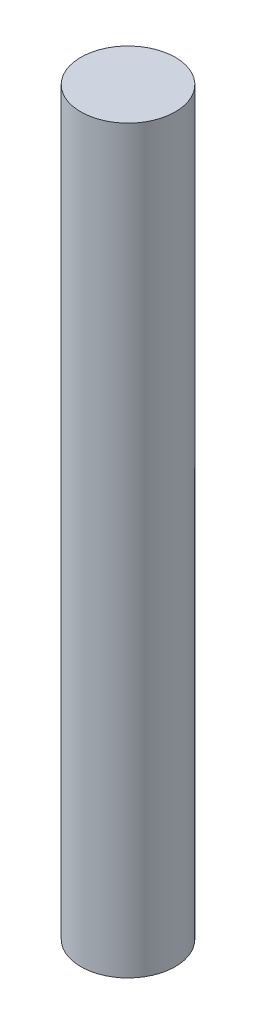
ISO-10303-21;
HEADER;
FILE_DESCRIPTION(('STEP AP214'),'2;1');
FILE_NAME('part.step','',(''),(''),'','','');
FILE_SCHEMA(('AUTOMOTIVE_DESIGN { 1 0 10303 214 1 1 1 1 }'));
ENDSEC;
DATA;
#1=APPLICATION_CONTEXT('core data for automotive mechanical design processes');
#2=APPLICATION_PROTOCOL_DEFINITION('international standard','automotive_design',2000,#1);
#3=PRODUCT_CONTEXT('',#1,'mechanical');
#4=PRODUCT('Part','Part','',(#3));
#5=PRODUCT_RELATED_PRODUCT_CATEGORY('part','',(#4));
#6=PRODUCT_DEFINITION_FORMATION('','',#4);
#7=PRODUCT_DEFINITION_CONTEXT('part definition',#1,'design');
#8=PRODUCT_DEFINITION('design','',#6,#7);
#9=PRODUCT_DEFINITION_SHAPE('','',#8);
#10=(LENGTH_UNIT() NAMED_UNIT(*) SI_UNIT(.MILLI.,.METRE.));
#11=(NAMED_UNIT(*) PLANE_ANGLE_UNIT() SI_UNIT($,.RADIAN.));
#12=(NAMED_UNIT(*) SI_UNIT($,.STERADIAN.) SOLID_ANGLE_UNIT());
#13=UNCERTAINTY_MEASURE_WITH_UNIT(LENGTH_MEASURE(1.E-05),#10,'distance_accuracy_value','');
#14=(GEOMETRIC_REPRESENTATION_CONTEXT(3) GLOBAL_UNCERTAINTY_ASSIGNED_CONTEXT((#13)) GLOBAL_UNIT_ASSIGNED_CONTEXT((#10,
#11,#12)) REPRESENTATION_CONTEXT('',''));
#15=CARTESIAN_POINT('',(0.,0.,0.));
#16=DIRECTION('',(0.,0.,1.));
#17=DIRECTION('',(1.,0.,0.));
#18=AXIS2_PLACEMENT_3D('',#15,#16,#17);
#19=CARTESIAN_POINT('',(0.,12.53,0.));
#20=DIRECTION('',(0.,-1.,0.));
#21=DIRECTION('',(0.,0.,-1.));
#22=AXIS2_PLACEMENT_3D('',#19,#20,#21);
#23=CYLINDRICAL_SURFACE('',#22,0.8);
#24=CARTESIAN_POINT('',(0.,12.53,0.));
#25=DIRECTION('',(0.,1.,0.));
#26=DIRECTION('',(0.,0.,1.));
#27=AXIS2_PLACEMENT_3D('',#24,#25,#26);
#28=CIRCLE('',#27,0.8);
#29=CARTESIAN_POINT('',(0.,12.53,-0.8));
#30=VERTEX_POINT('',#29);
#31=EDGE_CURVE('E10',#30,#30,#28,.T.);
#32=CARTESIAN_POINT('',(0.,0.,0.));
#33=DIRECTION('',(0.,1.,0.));
#34=DIRECTION('',(0.,0.,1.));
#35=AXIS2_PLACEMENT_3D('',#32,#33,#34);
#36=CIRCLE('',#35,0.8);
#37=CARTESIAN_POINT('',(0.,0.,-0.8));
#38=VERTEX_POINT('',#37);
#39=EDGE_CURVE('E46',#38,#38,#36,.T.);
#40=CARTESIAN_POINT('',(0.,12.53,-0.8));
#41=CARTESIAN_POINT('',(0.,12.3994791666667,-0.8));
#42=CARTESIAN_POINT('',(0.,12.2689583333333,-0.8));
#43=CARTESIAN_POINT('',(0.,12.0079166666667,-0.8));
#44=CARTESIAN_POINT('',(0.,11.8773958333333,-0.8));
#45=CARTESIAN_POINT('',(0.,11.6163541666667,-0.8));
#46=CARTESIAN_POINT('',(0.,11.4858333333333,-0.8));
#47=CARTESIAN_POINT('',(0.,11.2247916666667,-0.8));
#48=CARTESIAN_POINT('',(0.,11.0942708333333,-0.8));
#49=CARTESIAN_POINT('',(0.,10.8332291666667,-0.8));
#50=CARTESIAN_POINT('',(0.,10.7027083333333,-0.8));
#51=CARTESIAN_POINT('',(0.,10.4416666666667,-0.8));
#52=CARTESIAN_POINT('',(0.,10.3111458333333,-0.8));
#53=CARTESIAN_POINT('',(0.,10.0501041666667,-0.8));
#54=CARTESIAN_POINT('',(0.,9.91958333333333,-0.8));
#55=CARTESIAN_POINT('',(0.,9.65854166666667,-0.8));
#56=CARTESIAN_POINT('',(0.,9.52802083333333,-0.8));
#57=CARTESIAN_POINT('',(0.,9.26697916666667,-0.8));
#58=CARTESIAN_POINT('',(0.,9.13645833333333,-0.8));
#59=CARTESIAN_POINT('',(0.,8.87541666666666,-0.8));
#60=CARTESIAN_POINT('',(0.,8.74489583333333,-0.8));
#61=CARTESIAN_POINT('',(0.,8.48385416666667,-0.8));
#62=CARTESIAN_POINT('',(0.,8.35333333333333,-0.8));
#63=CARTESIAN_POINT('',(0.,8.09229166666667,-0.8));
#64=CARTESIAN_POINT('',(0.,7.96177083333333,-0.8));
#65=CARTESIAN_POINT('',(0.,7.70072916666666,-0.8));
#66=CARTESIAN_POINT('',(0.,7.57020833333333,-0.8));
#67=CARTESIAN_POINT('',(0.,7.30916666666667,-0.8));
#68=CARTESIAN_POINT('',(0.,7.17864583333333,-0.8));
#69=CARTESIAN_POINT('',(0.,6.91760416666667,-0.8));
#70=CARTESIAN_POINT('',(0.,6.78708333333333,-0.8));
#71=CARTESIAN_POINT('',(0.,6.52604166666667,-0.8));
#72=CARTESIAN_POINT('',(0.,6.39552083333333,-0.8));
#73=CARTESIAN_POINT('',(0.,6.13447916666667,-0.8));
#74=CARTESIAN_POINT('',(0.,6.00395833333333,-0.8));
#75=CARTESIAN_POINT('',(0.,5.74291666666667,-0.8));
#76=CARTESIAN_POINT('',(0.,5.61239583333333,-0.8));
#77=CARTESIAN_POINT('',(0.,5.35135416666667,-0.8));
#78=CARTESIAN_POINT('',(0.,5.22083333333333,-0.8));
#79=CARTESIAN_POINT('',(0.,4.95979166666667,-0.8));
#80=CARTESIAN_POINT('',(0.,4.82927083333333,-0.8));
#81=CARTESIAN_POINT('',(0.,4.56822916666667,-0.8));
#82=CARTESIAN_POINT('',(0.,4.43770833333333,-0.8));
#83=CARTESIAN_POINT('',(0.,4.17666666666666,-0.8));
#84=CARTESIAN_POINT('',(0.,4.04614583333333,-0.8));
#85=CARTESIAN_POINT('',(0.,3.78510416666667,-0.8));
#86=CARTESIAN_POINT('',(0.,3.65458333333333,-0.8));
#87=CARTESIAN_POINT('',(0.,3.39354166666667,-0.8));
#88=CARTESIAN_POINT('',(0.,3.26302083333333,-0.8));
#89=CARTESIAN_POINT('',(0.,3.00197916666666,-0.8));
#90=CARTESIAN_POINT('',(0.,2.87145833333333,-0.8));
#91=CARTESIAN_POINT('',(0.,2.61041666666667,-0.8));
#92=CARTESIAN_POINT('',(0.,2.47989583333333,-0.8));
#93=CARTESIAN_POINT('',(0.,2.21885416666667,-0.8));
#94=CARTESIAN_POINT('',(0.,2.08833333333333,-0.8));
#95=CARTESIAN_POINT('',(0.,1.82729166666666,-0.8));
#96=CARTESIAN_POINT('',(0.,1.69677083333333,-0.8));
#97=CARTESIAN_POINT('',(0.,1.43572916666666,-0.8));
#98=CARTESIAN_POINT('',(0.,1.30520833333333,-0.8));
#99=CARTESIAN_POINT('',(0.,1.04416666666667,-0.8));
#100=CARTESIAN_POINT('',(0.,0.913645833333332,-0.8));
#101=CARTESIAN_POINT('',(0.,0.652604166666665,-0.8));
#102=CARTESIAN_POINT('',(0.,0.522083333333332,-0.8));
#103=CARTESIAN_POINT('',(0.,0.261041666666665,-0.8));
#104=CARTESIAN_POINT('',(0.,0.130520833333331,-0.8));
#105=CARTESIAN_POINT('',(0.,0.,-0.8));
#106=B_SPLINE_CURVE_WITH_KNOTS('',3,(#40,#41,#42,#43,#44,#45,#46,#47,#48,#49,#50,#51,#52,#53,
#54,#55,#56,#57,#58,#59,#60,#61,#62,#63,#64,#65,#66,#67,#68,#69,#70,#71,#72,#73,#74,#75,#76,#77,
#78,#79,#80,#81,#82,#83,#84,#85,#86,#87,#88,#89,#90,#91,#92,#93,#94,#95,#96,#97,#98,#99,#100,
#101,#102,#103,#104,#105),.UNSPECIFIED.,.F.,.F.,(4,2,2,2,2,2,2,2,2,2,2,2,2,2,2,2,2,2,2,2,2,2,2,
2,2,2,2,2,2,2,2,2,4),(0.,0.3915625,0.783124999999999,1.1746875,1.56625,1.9578125,2.349375,
2.7409375,3.1325,3.5240625,3.915625,4.3071875,4.69875,5.0903125,5.481875,5.8734375,6.265,
6.6565625,7.048125,7.4396875,7.83125,8.2228125,8.614375,9.0059375,9.3975,9.7890625,10.180625,
10.5721875,10.96375,11.3553125,11.746875,12.1384375,12.53),.UNSPECIFIED.);
#107=EDGE_CURVE('BSEAM43',#30,#38,#106,.T.);
#108=ORIENTED_EDGE('',*,*,#31,.F.);
#109=ORIENTED_EDGE('',*,*,#39,.T.);
#110=ORIENTED_EDGE('',*,*,#107,.T.);
#111=ORIENTED_EDGE('',*,*,#107,.F.);
#112=EDGE_LOOP('',(#108,#110,#109,#111));
#113=FACE_BOUND('',#112,.T.);
#114=ADVANCED_FACE('F43',(#113),#23,.T.);
#115=CARTESIAN_POINT('',(0.,12.53,0.));
#116=DIRECTION('',(0.,1.,0.));
#117=DIRECTION('',(0.,0.,1.));
#118=AXIS2_PLACEMENT_3D('',#115,#116,#117);
#119=PLANE('',#118);
#120=ORIENTED_EDGE('',*,*,#31,.T.);
#121=EDGE_LOOP('',(#120));
#122=FACE_BOUND('',#121,.T.);
#123=ADVANCED_FACE('F60',(#122),#119,.T.);
#124=CARTESIAN_POINT('',(0.,0.,0.));
#125=DIRECTION('',(0.,1.,0.));
#126=DIRECTION('',(0.,0.,1.));
#127=AXIS2_PLACEMENT_3D('',#124,#125,#126);
#128=PLANE('',#127);
#129=ORIENTED_EDGE('',*,*,#39,.F.);
#130=EDGE_LOOP('',(#129));
#131=FACE_BOUND('',#130,.T.);
#132=ADVANCED_FACE('F58',(#131),#128,.F.);
#133=CLOSED_SHELL('',(#114,#123,#132));
#134=MANIFOLD_SOLID_BREP('B2',#133);
#135=ADVANCED_BREP_SHAPE_REPRESENTATION('',(#18,#134),#14);
#136=SHAPE_DEFINITION_REPRESENTATION(#9,#135);
ENDSEC;
END-ISO-10303-21;
